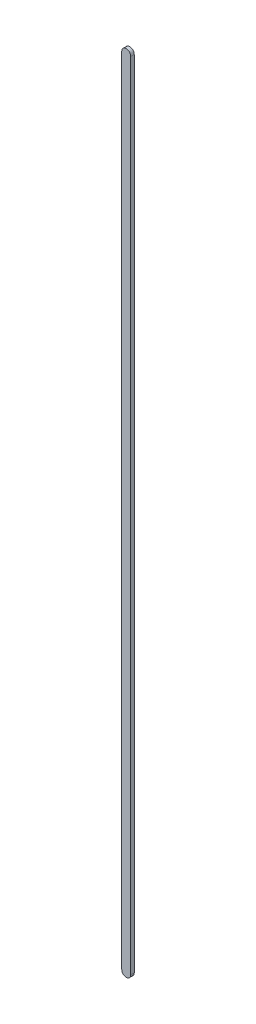
ISO-10303-21;
HEADER;
FILE_DESCRIPTION(('STEP AP214'),'2;1');
FILE_NAME('part.step','',(''),(''),'','','');
FILE_SCHEMA(('AUTOMOTIVE_DESIGN { 1 0 10303 214 1 1 1 1 }'));
ENDSEC;
DATA;
#1=APPLICATION_CONTEXT('core data for automotive mechanical design processes');
#2=APPLICATION_PROTOCOL_DEFINITION('international standard','automotive_design',2000,#1);
#3=PRODUCT_CONTEXT('',#1,'mechanical');
#4=PRODUCT('Part','Part','',(#3));
#5=PRODUCT_RELATED_PRODUCT_CATEGORY('part','',(#4));
#6=PRODUCT_DEFINITION_FORMATION('','',#4);
#7=PRODUCT_DEFINITION_CONTEXT('part definition',#1,'design');
#8=PRODUCT_DEFINITION('design','',#6,#7);
#9=PRODUCT_DEFINITION_SHAPE('','',#8);
#10=(LENGTH_UNIT() NAMED_UNIT(*) SI_UNIT(.MILLI.,.METRE.));
#11=(NAMED_UNIT(*) PLANE_ANGLE_UNIT() SI_UNIT($,.RADIAN.));
#12=(NAMED_UNIT(*) SI_UNIT($,.STERADIAN.) SOLID_ANGLE_UNIT());
#13=UNCERTAINTY_MEASURE_WITH_UNIT(LENGTH_MEASURE(1.E-05),#10,'distance_accuracy_value','');
#14=(GEOMETRIC_REPRESENTATION_CONTEXT(3) GLOBAL_UNCERTAINTY_ASSIGNED_CONTEXT((#13)) GLOBAL_UNIT_ASSIGNED_CONTEXT((#10,
#11,#12)) REPRESENTATION_CONTEXT('',''));
#15=CARTESIAN_POINT('',(0.,0.,0.));
#16=DIRECTION('',(0.,0.,1.));
#17=DIRECTION('',(1.,0.,0.));
#18=AXIS2_PLACEMENT_3D('',#15,#16,#17);
#19=CARTESIAN_POINT('',(120.8532,69.9008,0.));
#20=DIRECTION('',(-1.,0.,0.));
#21=DIRECTION('',(0.,1.,0.));
#22=AXIS2_PLACEMENT_3D('',#19,#20,#21);
#23=PLANE('',#22);
#24=DIRECTION('',(0.,1.,0.));
#25=VECTOR('',#24,1.);
#26=CARTESIAN_POINT('',(120.8532,69.9008,0.1999996));
#27=LINE('',#26,#25);
#28=CARTESIAN_POINT('',(120.8532,69.9008,0.1999996));
#29=VERTEX_POINT('',#28);
#30=CARTESIAN_POINT('',(120.8532,114.9096,0.1999996));
#31=VERTEX_POINT('',#30);
#32=EDGE_CURVE('E11',#29,#31,#27,.T.);
#33=ORIENTED_EDGE('',*,*,#32,.F.);
#34=DIRECTION('',(0.,0.,1.));
#35=VECTOR('',#34,1.);
#36=CARTESIAN_POINT('',(120.8532,69.9008,0.));
#37=LINE('',#36,#35);
#38=CARTESIAN_POINT('',(120.8532,69.9008,0.));
#39=VERTEX_POINT('',#38);
#40=EDGE_CURVE('E24',#39,#29,#37,.T.);
#41=ORIENTED_EDGE('',*,*,#40,.F.);
#42=DIRECTION('',(0.,1.,0.));
#43=VECTOR('',#42,1.);
#44=CARTESIAN_POINT('',(120.8532,69.9008,0.));
#45=LINE('',#44,#43);
#46=CARTESIAN_POINT('',(120.8532,114.9096,0.));
#47=VERTEX_POINT('',#46);
#48=EDGE_CURVE('E75',#39,#47,#45,.T.);
#49=ORIENTED_EDGE('',*,*,#48,.T.);
#50=DIRECTION('',(0.,0.,1.));
#51=VECTOR('',#50,1.);
#52=CARTESIAN_POINT('',(120.8532,114.9096,0.));
#53=LINE('',#52,#51);
#54=EDGE_CURVE('E37',#47,#31,#53,.T.);
#55=ORIENTED_EDGE('',*,*,#54,.T.);
#56=EDGE_LOOP('',(#33,#41,#49,#55));
#57=FACE_BOUND('',#56,.T.);
#58=ADVANCED_FACE('F17',(#57),#23,.F.);
#59=CARTESIAN_POINT('',(120.5992,114.9096,0.));
#60=DIRECTION('',(0.,0.,-1.));
#61=DIRECTION('',(1.,0.,0.));
#62=AXIS2_PLACEMENT_3D('',#59,#60,#61);
#63=CYLINDRICAL_SURFACE('',#62,0.254);
#64=CARTESIAN_POINT('',(120.5992,114.9096,0.1999996));
#65=DIRECTION('',(0.,0.,1.));
#66=DIRECTION('',(1.,0.,0.));
#67=AXIS2_PLACEMENT_3D('',#64,#65,#66);
#68=CIRCLE('',#67,0.254);
#69=CARTESIAN_POINT('',(120.3452,114.9096,0.1999996));
#70=VERTEX_POINT('',#69);
#71=EDGE_CURVE('E83',#31,#70,#68,.T.);
#72=ORIENTED_EDGE('',*,*,#71,.F.);
#73=ORIENTED_EDGE('',*,*,#54,.F.);
#74=CARTESIAN_POINT('',(120.5992,114.9096,0.));
#75=DIRECTION('',(0.,0.,1.));
#76=DIRECTION('',(1.,0.,0.));
#77=AXIS2_PLACEMENT_3D('',#74,#75,#76);
#78=CIRCLE('',#77,0.254);
#79=CARTESIAN_POINT('',(120.3452,114.9096,0.));
#80=VERTEX_POINT('',#79);
#81=EDGE_CURVE('E81',#47,#80,#78,.T.);
#82=ORIENTED_EDGE('',*,*,#81,.T.);
#83=DIRECTION('',(0.,0.,1.));
#84=VECTOR('',#83,1.);
#85=CARTESIAN_POINT('',(120.3452,114.9096,0.));
#86=LINE('',#85,#84);
#87=EDGE_CURVE('E67',#80,#70,#86,.T.);
#88=ORIENTED_EDGE('',*,*,#87,.T.);
#89=EDGE_LOOP('',(#72,#73,#82,#88));
#90=FACE_BOUND('',#89,.T.);
#91=ADVANCED_FACE('F89',(#90),#63,.T.);
#92=CARTESIAN_POINT('',(120.3452,114.9096,0.));
#93=DIRECTION('',(1.,0.,0.));
#94=DIRECTION('',(0.,-1.,0.));
#95=AXIS2_PLACEMENT_3D('',#92,#93,#94);
#96=PLANE('',#95);
#97=DIRECTION('',(0.,-1.,0.));
#98=VECTOR('',#97,1.);
#99=CARTESIAN_POINT('',(120.3452,114.9096,0.1999996));
#100=LINE('',#99,#98);
#101=CARTESIAN_POINT('',(120.3452,69.9008,0.1999996));
#102=VERTEX_POINT('',#101);
#103=EDGE_CURVE('E71',#70,#102,#100,.T.);
#104=ORIENTED_EDGE('',*,*,#103,.F.);
#105=ORIENTED_EDGE('',*,*,#87,.F.);
#106=DIRECTION('',(0.,-1.,0.));
#107=VECTOR('',#106,1.);
#108=CARTESIAN_POINT('',(120.3452,114.9096,0.));
#109=LINE('',#108,#107);
#110=CARTESIAN_POINT('',(120.3452,69.9008,0.));
#111=VERTEX_POINT('',#110);
#112=EDGE_CURVE('E63',#80,#111,#109,.T.);
#113=ORIENTED_EDGE('',*,*,#112,.T.);
#114=DIRECTION('',(0.,0.,1.));
#115=VECTOR('',#114,1.);
#116=CARTESIAN_POINT('',(120.3452,69.9008,0.));
#117=LINE('',#116,#115);
#118=EDGE_CURVE('E53',#111,#102,#117,.T.);
#119=ORIENTED_EDGE('',*,*,#118,.T.);
#120=EDGE_LOOP('',(#104,#105,#113,#119));
#121=FACE_BOUND('',#120,.T.);
#122=ADVANCED_FACE('F66',(#121),#96,.F.);
#123=CARTESIAN_POINT('',(120.5992,69.9008,0.));
#124=DIRECTION('',(0.,0.,-1.));
#125=DIRECTION('',(-1.,0.,0.));
#126=AXIS2_PLACEMENT_3D('',#123,#124,#125);
#127=CYLINDRICAL_SURFACE('',#126,0.253999999999995);
#128=CARTESIAN_POINT('',(120.5992,69.9008,0.1999996));
#129=DIRECTION('',(0.,0.,1.));
#130=DIRECTION('',(-1.,0.,0.));
#131=AXIS2_PLACEMENT_3D('',#128,#129,#130);
#132=CIRCLE('',#131,0.253999999999995);
#133=EDGE_CURVE('E59',#102,#29,#132,.T.);
#134=ORIENTED_EDGE('',*,*,#133,.F.);
#135=ORIENTED_EDGE('',*,*,#118,.F.);
#136=CARTESIAN_POINT('',(120.5992,69.9008,0.));
#137=DIRECTION('',(0.,0.,1.));
#138=DIRECTION('',(-1.,0.,0.));
#139=AXIS2_PLACEMENT_3D('',#136,#137,#138);
#140=CIRCLE('',#139,0.253999999999995);
#141=EDGE_CURVE('E57',#111,#39,#140,.T.);
#142=ORIENTED_EDGE('',*,*,#141,.T.);
#143=ORIENTED_EDGE('',*,*,#40,.T.);
#144=EDGE_LOOP('',(#134,#135,#142,#143));
#145=FACE_BOUND('',#144,.T.);
#146=ADVANCED_FACE('F55',(#145),#127,.T.);
#147=CARTESIAN_POINT('',(120.8532,69.9008,0.));
#148=DIRECTION('',(0.,0.,-1.));
#149=DIRECTION('',(-1.,0.,0.));
#150=AXIS2_PLACEMENT_3D('',#147,#148,#149);
#151=PLANE('',#150);
#152=ORIENTED_EDGE('',*,*,#141,.F.);
#153=ORIENTED_EDGE('',*,*,#112,.F.);
#154=ORIENTED_EDGE('',*,*,#81,.F.);
#155=ORIENTED_EDGE('',*,*,#48,.F.);
#156=EDGE_LOOP('',(#152,#153,#154,#155));
#157=FACE_BOUND('',#156,.T.);
#158=ADVANCED_FACE('F74',(#157),#151,.T.);
#159=CARTESIAN_POINT('',(120.8532,69.9008,0.1999996));
#160=DIRECTION('',(0.,0.,-1.));
#161=DIRECTION('',(-1.,0.,0.));
#162=AXIS2_PLACEMENT_3D('',#159,#160,#161);
#163=PLANE('',#162);
#164=ORIENTED_EDGE('',*,*,#32,.T.);
#165=ORIENTED_EDGE('',*,*,#71,.T.);
#166=ORIENTED_EDGE('',*,*,#103,.T.);
#167=ORIENTED_EDGE('',*,*,#133,.T.);
#168=EDGE_LOOP('',(#164,#165,#166,#167));
#169=FACE_BOUND('',#168,.T.);
#170=ADVANCED_FACE('F91',(#169),#163,.F.);
#171=CLOSED_SHELL('',(#58,#91,#122,#146,#158,#170));
#172=MANIFOLD_SOLID_BREP('B1',#171);
#173=ADVANCED_BREP_SHAPE_REPRESENTATION('',(#18,#172),#14);
#174=SHAPE_DEFINITION_REPRESENTATION(#9,#173);
ENDSEC;
END-ISO-10303-21;
